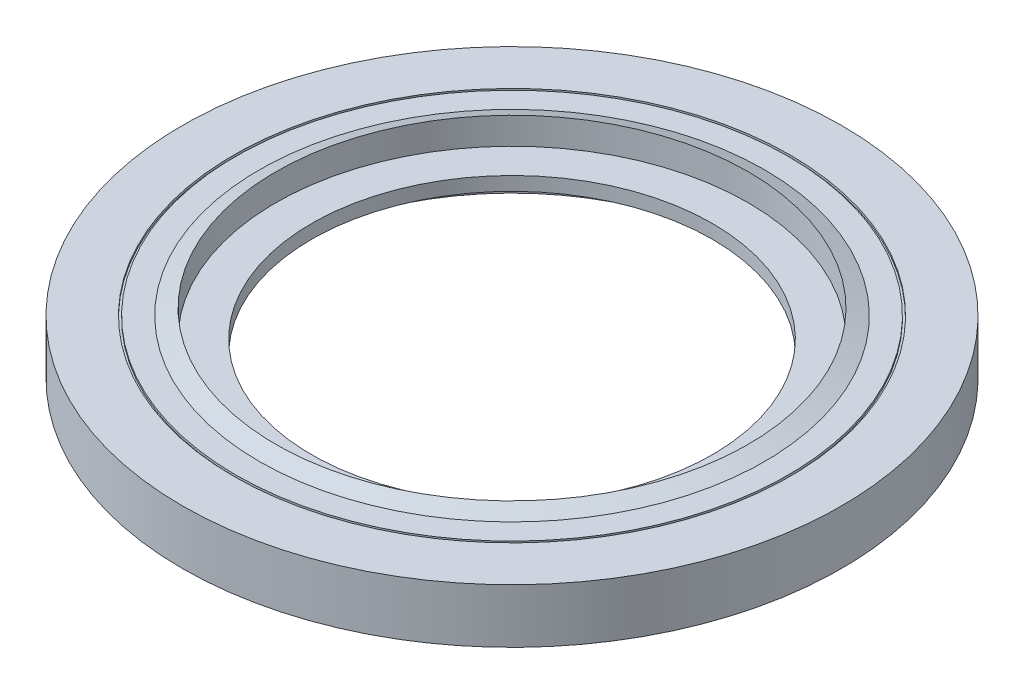
ISO-10303-21;
HEADER;
FILE_DESCRIPTION(('STEP AP214'),'2;1');
FILE_NAME('part.step','',(''),(''),'','','');
FILE_SCHEMA(('AUTOMOTIVE_DESIGN { 1 0 10303 214 1 1 1 1 }'));
ENDSEC;
DATA;
#1=APPLICATION_CONTEXT('core data for automotive mechanical design processes');
#2=APPLICATION_PROTOCOL_DEFINITION('international standard','automotive_design',2000,#1);
#3=PRODUCT_CONTEXT('',#1,'mechanical');
#4=PRODUCT('Part','Part','',(#3));
#5=PRODUCT_RELATED_PRODUCT_CATEGORY('part','',(#4));
#6=PRODUCT_DEFINITION_FORMATION('','',#4);
#7=PRODUCT_DEFINITION_CONTEXT('part definition',#1,'design');
#8=PRODUCT_DEFINITION('design','',#6,#7);
#9=PRODUCT_DEFINITION_SHAPE('','',#8);
#10=(LENGTH_UNIT() NAMED_UNIT(*) SI_UNIT(.MILLI.,.METRE.));
#11=(NAMED_UNIT(*) PLANE_ANGLE_UNIT() SI_UNIT($,.RADIAN.));
#12=(NAMED_UNIT(*) SI_UNIT($,.STERADIAN.) SOLID_ANGLE_UNIT());
#13=UNCERTAINTY_MEASURE_WITH_UNIT(LENGTH_MEASURE(1.E-05),#10,'distance_accuracy_value','');
#14=(GEOMETRIC_REPRESENTATION_CONTEXT(3) GLOBAL_UNCERTAINTY_ASSIGNED_CONTEXT((#13)) GLOBAL_UNIT_ASSIGNED_CONTEXT((#10,
#11,#12)) REPRESENTATION_CONTEXT('',''));
#15=CARTESIAN_POINT('',(0.,0.,0.));
#16=DIRECTION('',(0.,0.,1.));
#17=DIRECTION('',(1.,0.,0.));
#18=AXIS2_PLACEMENT_3D('',#15,#16,#17);
#19=CARTESIAN_POINT('',(9.12,-0.312500000000001,0.));
#20=DIRECTION('',(0.,-1.,0.));
#21=DIRECTION('',(0.,0.,-1.));
#22=AXIS2_PLACEMENT_3D('',#19,#20,#21);
#23=PLANE('',#22);
#24=CARTESIAN_POINT('',(0.,-0.312500000000001,0.));
#25=DIRECTION('',(0.,-1.,0.));
#26=DIRECTION('',(0.,0.,-1.));
#27=AXIS2_PLACEMENT_3D('',#24,#25,#26);
#28=CIRCLE('',#27,10.75);
#29=CARTESIAN_POINT('',(0.,-0.312500000000001,-10.75));
#30=VERTEX_POINT('',#29);
#31=EDGE_CURVE('E10',#30,#30,#28,.T.);
#32=ORIENTED_EDGE('',*,*,#31,.T.);
#33=EDGE_LOOP('',(#32));
#34=FACE_BOUND('',#33,.T.);
#35=CARTESIAN_POINT('',(0.,-0.312500000000001,0.));
#36=DIRECTION('',(0.,-1.,0.));
#37=DIRECTION('',(0.,0.,-1.));
#38=AXIS2_PLACEMENT_3D('',#35,#36,#37);
#39=CIRCLE('',#38,9.12);
#40=CARTESIAN_POINT('',(0.,-0.312500000000001,-9.12));
#41=VERTEX_POINT('',#40);
#42=EDGE_CURVE('E103',#41,#41,#39,.T.);
#43=ORIENTED_EDGE('',*,*,#42,.F.);
#44=EDGE_LOOP('',(#43));
#45=FACE_BOUND('',#44,.T.);
#46=ADVANCED_FACE('F45',(#34,#45),#23,.T.);
#47=CARTESIAN_POINT('',(0.,0.,0.));
#48=DIRECTION('',(0.,-1.,0.));
#49=DIRECTION('',(0.,0.,-1.));
#50=AXIS2_PLACEMENT_3D('',#47,#48,#49);
#51=CYLINDRICAL_SURFACE('',#50,10.75);
#52=CARTESIAN_POINT('',(0.,-1.535,0.));
#53=DIRECTION('',(0.,-1.,0.));
#54=DIRECTION('',(0.,0.,-1.));
#55=AXIS2_PLACEMENT_3D('',#52,#53,#54);
#56=CIRCLE('',#55,10.75);
#57=CARTESIAN_POINT('',(0.,-1.535,-10.75));
#58=VERTEX_POINT('',#57);
#59=EDGE_CURVE('E51',#58,#58,#56,.T.);
#60=ORIENTED_EDGE('',*,*,#59,.T.);
#61=EDGE_LOOP('',(#60));
#62=FACE_BOUND('',#61,.T.);
#63=ORIENTED_EDGE('',*,*,#31,.F.);
#64=EDGE_LOOP('',(#63));
#65=FACE_BOUND('',#64,.T.);
#66=ADVANCED_FACE('F111',(#62,#65),#51,.F.);
#67=CARTESIAN_POINT('',(0.,-1.535,0.));
#68=DIRECTION('',(0.,1.,0.));
#69=DIRECTION('',(0.,0.,1.));
#70=AXIS2_PLACEMENT_3D('',#67,#68,#69);
#71=CONICAL_SURFACE('',#70,10.75,1.19028994968253);
#72=CARTESIAN_POINT('',(0.,-1.235,0.));
#73=DIRECTION('',(0.,-1.,0.));
#74=DIRECTION('',(0.,0.,-1.));
#75=AXIS2_PLACEMENT_3D('',#72,#73,#74);
#76=CIRCLE('',#75,11.5);
#77=CARTESIAN_POINT('',(0.,-1.235,-11.5));
#78=VERTEX_POINT('',#77);
#79=EDGE_CURVE('E55',#78,#78,#76,.T.);
#80=ORIENTED_EDGE('',*,*,#79,.T.);
#81=EDGE_LOOP('',(#80));
#82=FACE_BOUND('',#81,.T.);
#83=ORIENTED_EDGE('',*,*,#59,.F.);
#84=EDGE_LOOP('',(#83));
#85=FACE_BOUND('',#84,.T.);
#86=ADVANCED_FACE('F115',(#82,#85),#71,.T.);
#87=CARTESIAN_POINT('',(11.5,-1.235,0.));
#88=DIRECTION('',(0.,-1.,0.));
#89=DIRECTION('',(0.,0.,-1.));
#90=AXIS2_PLACEMENT_3D('',#87,#88,#89);
#91=PLANE('',#90);
#92=CARTESIAN_POINT('',(0.,-1.235,0.));
#93=DIRECTION('',(0.,-1.,0.));
#94=DIRECTION('',(0.,0.,-1.));
#95=AXIS2_PLACEMENT_3D('',#92,#93,#94);
#96=CIRCLE('',#95,12.5666666666667);
#97=CARTESIAN_POINT('',(0.,-1.235,-12.5666666666667));
#98=VERTEX_POINT('',#97);
#99=EDGE_CURVE('E59',#98,#98,#96,.T.);
#100=ORIENTED_EDGE('',*,*,#99,.T.);
#101=EDGE_LOOP('',(#100));
#102=FACE_BOUND('',#101,.T.);
#103=ORIENTED_EDGE('',*,*,#79,.F.);
#104=EDGE_LOOP('',(#103));
#105=FACE_BOUND('',#104,.T.);
#106=ADVANCED_FACE('F119',(#102,#105),#91,.T.);
#107=CARTESIAN_POINT('',(0.,0.,0.));
#108=DIRECTION('',(0.,-1.,0.));
#109=DIRECTION('',(0.,0.,-1.));
#110=AXIS2_PLACEMENT_3D('',#107,#108,#109);
#111=CYLINDRICAL_SURFACE('',#110,12.5666666666667);
#112=CARTESIAN_POINT('',(0.,-1.135,0.));
#113=DIRECTION('',(0.,-1.,0.));
#114=DIRECTION('',(0.,0.,-1.));
#115=AXIS2_PLACEMENT_3D('',#112,#113,#114);
#116=CIRCLE('',#115,12.5666666666667);
#117=CARTESIAN_POINT('',(0.,-1.135,-12.5666666666667));
#118=VERTEX_POINT('',#117);
#119=EDGE_CURVE('E64',#118,#118,#116,.T.);
#120=ORIENTED_EDGE('',*,*,#119,.T.);
#121=EDGE_LOOP('',(#120));
#122=FACE_BOUND('',#121,.T.);
#123=ORIENTED_EDGE('',*,*,#99,.F.);
#124=EDGE_LOOP('',(#123));
#125=FACE_BOUND('',#124,.T.);
#126=ADVANCED_FACE('F126',(#122,#125),#111,.T.);
#127=CARTESIAN_POINT('',(12.6666666666667,-1.135,0.));
#128=DIRECTION('',(0.,-1.,0.));
#129=DIRECTION('',(0.,0.,-1.));
#130=AXIS2_PLACEMENT_3D('',#127,#128,#129);
#131=PLANE('',#130);
#132=CARTESIAN_POINT('',(0.,-1.135,0.));
#133=DIRECTION('',(0.,-1.,0.));
#134=DIRECTION('',(0.,0.,-1.));
#135=AXIS2_PLACEMENT_3D('',#132,#133,#134);
#136=CIRCLE('',#135,12.6666666666667);
#137=CARTESIAN_POINT('',(0.,-1.135,-12.6666666666667));
#138=VERTEX_POINT('',#137);
#139=EDGE_CURVE('E67',#138,#138,#136,.T.);
#140=ORIENTED_EDGE('',*,*,#139,.T.);
#141=EDGE_LOOP('',(#140));
#142=FACE_BOUND('',#141,.T.);
#143=ORIENTED_EDGE('',*,*,#119,.F.);
#144=EDGE_LOOP('',(#143));
#145=FACE_BOUND('',#144,.T.);
#146=ADVANCED_FACE('F130',(#142,#145),#131,.T.);
#147=CARTESIAN_POINT('',(0.,0.,0.));
#148=DIRECTION('',(0.,-1.,0.));
#149=DIRECTION('',(0.,0.,-1.));
#150=AXIS2_PLACEMENT_3D('',#147,#148,#149);
#151=CYLINDRICAL_SURFACE('',#150,12.6666666666667);
#152=CARTESIAN_POINT('',(0.,-1.235,0.));
#153=DIRECTION('',(0.,-1.,0.));
#154=DIRECTION('',(0.,0.,-1.));
#155=AXIS2_PLACEMENT_3D('',#152,#153,#154);
#156=CIRCLE('',#155,12.6666666666667);
#157=CARTESIAN_POINT('',(0.,-1.235,-12.6666666666667));
#158=VERTEX_POINT('',#157);
#159=EDGE_CURVE('E70',#158,#158,#156,.T.);
#160=ORIENTED_EDGE('',*,*,#159,.T.);
#161=EDGE_LOOP('',(#160));
#162=FACE_BOUND('',#161,.T.);
#163=ORIENTED_EDGE('',*,*,#139,.F.);
#164=EDGE_LOOP('',(#163));
#165=FACE_BOUND('',#164,.T.);
#166=ADVANCED_FACE('F134',(#162,#165),#151,.F.);
#167=CARTESIAN_POINT('',(12.6666666666667,-1.235,0.));
#168=DIRECTION('',(0.,-1.,0.));
#169=DIRECTION('',(0.,0.,-1.));
#170=AXIS2_PLACEMENT_3D('',#167,#168,#169);
#171=PLANE('',#170);
#172=CARTESIAN_POINT('',(0.,-1.235,0.));
#173=DIRECTION('',(0.,-1.,0.));
#174=DIRECTION('',(0.,0.,-1.));
#175=AXIS2_PLACEMENT_3D('',#172,#173,#174);
#176=CIRCLE('',#175,15.);
#177=CARTESIAN_POINT('',(0.,-1.235,-15.));
#178=VERTEX_POINT('',#177);
#179=EDGE_CURVE('E73',#178,#178,#176,.T.);
#180=ORIENTED_EDGE('',*,*,#179,.T.);
#181=EDGE_LOOP('',(#180));
#182=FACE_BOUND('',#181,.T.);
#183=ORIENTED_EDGE('',*,*,#159,.F.);
#184=EDGE_LOOP('',(#183));
#185=FACE_BOUND('',#184,.T.);
#186=ADVANCED_FACE('F138',(#182,#185),#171,.T.);
#187=CARTESIAN_POINT('',(0.,0.,0.));
#188=DIRECTION('',(0.,-1.,0.));
#189=DIRECTION('',(0.,0.,-1.));
#190=AXIS2_PLACEMENT_3D('',#187,#188,#189);
#191=CYLINDRICAL_SURFACE('',#190,15.);
#192=CARTESIAN_POINT('',(0.,1.235,0.));
#193=DIRECTION('',(0.,-1.,0.));
#194=DIRECTION('',(0.,0.,-1.));
#195=AXIS2_PLACEMENT_3D('',#192,#193,#194);
#196=CIRCLE('',#195,15.);
#197=CARTESIAN_POINT('',(0.,1.235,-15.));
#198=VERTEX_POINT('',#197);
#199=EDGE_CURVE('E76',#198,#198,#196,.T.);
#200=ORIENTED_EDGE('',*,*,#199,.T.);
#201=EDGE_LOOP('',(#200));
#202=FACE_BOUND('',#201,.T.);
#203=ORIENTED_EDGE('',*,*,#179,.F.);
#204=EDGE_LOOP('',(#203));
#205=FACE_BOUND('',#204,.T.);
#206=ADVANCED_FACE('F142',(#202,#205),#191,.T.);
#207=CARTESIAN_POINT('',(15.,1.235,0.));
#208=DIRECTION('',(0.,1.,0.));
#209=DIRECTION('',(0.,0.,1.));
#210=AXIS2_PLACEMENT_3D('',#207,#208,#209);
#211=PLANE('',#210);
#212=CARTESIAN_POINT('',(0.,1.235,0.));
#213=DIRECTION('',(0.,-1.,0.));
#214=DIRECTION('',(0.,0.,-1.));
#215=AXIS2_PLACEMENT_3D('',#212,#213,#214);
#216=CIRCLE('',#215,12.6666666666667);
#217=CARTESIAN_POINT('',(0.,1.235,-12.6666666666667));
#218=VERTEX_POINT('',#217);
#219=EDGE_CURVE('E79',#218,#218,#216,.T.);
#220=ORIENTED_EDGE('',*,*,#219,.T.);
#221=EDGE_LOOP('',(#220));
#222=FACE_BOUND('',#221,.T.);
#223=ORIENTED_EDGE('',*,*,#199,.F.);
#224=EDGE_LOOP('',(#223));
#225=FACE_BOUND('',#224,.T.);
#226=ADVANCED_FACE('F146',(#222,#225),#211,.T.);
#227=CARTESIAN_POINT('',(0.,0.,0.));
#228=DIRECTION('',(0.,-1.,0.));
#229=DIRECTION('',(0.,0.,-1.));
#230=AXIS2_PLACEMENT_3D('',#227,#228,#229);
#231=CYLINDRICAL_SURFACE('',#230,12.6666666666667);
#232=CARTESIAN_POINT('',(0.,1.135,0.));
#233=DIRECTION('',(0.,-1.,0.));
#234=DIRECTION('',(0.,0.,-1.));
#235=AXIS2_PLACEMENT_3D('',#232,#233,#234);
#236=CIRCLE('',#235,12.6666666666667);
#237=CARTESIAN_POINT('',(0.,1.135,-12.6666666666667));
#238=VERTEX_POINT('',#237);
#239=EDGE_CURVE('E82',#238,#238,#236,.T.);
#240=ORIENTED_EDGE('',*,*,#239,.T.);
#241=EDGE_LOOP('',(#240));
#242=FACE_BOUND('',#241,.T.);
#243=ORIENTED_EDGE('',*,*,#219,.F.);
#244=EDGE_LOOP('',(#243));
#245=FACE_BOUND('',#244,.T.);
#246=ADVANCED_FACE('F150',(#242,#245),#231,.F.);
#247=CARTESIAN_POINT('',(12.6666666666667,1.135,0.));
#248=DIRECTION('',(0.,1.,0.));
#249=DIRECTION('',(0.,0.,1.));
#250=AXIS2_PLACEMENT_3D('',#247,#248,#249);
#251=PLANE('',#250);
#252=CARTESIAN_POINT('',(0.,1.135,0.));
#253=DIRECTION('',(0.,-1.,0.));
#254=DIRECTION('',(0.,0.,-1.));
#255=AXIS2_PLACEMENT_3D('',#252,#253,#254);
#256=CIRCLE('',#255,12.5666666666667);
#257=CARTESIAN_POINT('',(0.,1.135,-12.5666666666667));
#258=VERTEX_POINT('',#257);
#259=EDGE_CURVE('E85',#258,#258,#256,.T.);
#260=ORIENTED_EDGE('',*,*,#259,.T.);
#261=EDGE_LOOP('',(#260));
#262=FACE_BOUND('',#261,.T.);
#263=ORIENTED_EDGE('',*,*,#239,.F.);
#264=EDGE_LOOP('',(#263));
#265=FACE_BOUND('',#264,.T.);
#266=ADVANCED_FACE('F154',(#262,#265),#251,.T.);
#267=CARTESIAN_POINT('',(0.,0.,0.));
#268=DIRECTION('',(0.,-1.,0.));
#269=DIRECTION('',(0.,0.,-1.));
#270=AXIS2_PLACEMENT_3D('',#267,#268,#269);
#271=CYLINDRICAL_SURFACE('',#270,12.5666666666667);
#272=CARTESIAN_POINT('',(0.,1.235,0.));
#273=DIRECTION('',(0.,-1.,0.));
#274=DIRECTION('',(0.,0.,-1.));
#275=AXIS2_PLACEMENT_3D('',#272,#273,#274);
#276=CIRCLE('',#275,12.5666666666667);
#277=CARTESIAN_POINT('',(0.,1.235,-12.5666666666667));
#278=VERTEX_POINT('',#277);
#279=EDGE_CURVE('E88',#278,#278,#276,.T.);
#280=ORIENTED_EDGE('',*,*,#279,.T.);
#281=EDGE_LOOP('',(#280));
#282=FACE_BOUND('',#281,.T.);
#283=ORIENTED_EDGE('',*,*,#259,.F.);
#284=EDGE_LOOP('',(#283));
#285=FACE_BOUND('',#284,.T.);
#286=ADVANCED_FACE('F158',(#282,#285),#271,.T.);
#287=CARTESIAN_POINT('',(11.5,1.235,0.));
#288=DIRECTION('',(0.,1.,0.));
#289=DIRECTION('',(0.,0.,1.));
#290=AXIS2_PLACEMENT_3D('',#287,#288,#289);
#291=PLANE('',#290);
#292=CARTESIAN_POINT('',(0.,1.235,0.));
#293=DIRECTION('',(0.,-1.,0.));
#294=DIRECTION('',(0.,0.,-1.));
#295=AXIS2_PLACEMENT_3D('',#292,#293,#294);
#296=CIRCLE('',#295,11.5);
#297=CARTESIAN_POINT('',(0.,1.235,-11.5));
#298=VERTEX_POINT('',#297);
#299=EDGE_CURVE('E91',#298,#298,#296,.T.);
#300=ORIENTED_EDGE('',*,*,#299,.T.);
#301=EDGE_LOOP('',(#300));
#302=FACE_BOUND('',#301,.T.);
#303=ORIENTED_EDGE('',*,*,#279,.F.);
#304=EDGE_LOOP('',(#303));
#305=FACE_BOUND('',#304,.T.);
#306=ADVANCED_FACE('F162',(#302,#305),#291,.T.);
#307=CARTESIAN_POINT('',(0.,1.235,0.));
#308=DIRECTION('',(0.,-1.,0.));
#309=DIRECTION('',(0.,0.,-1.));
#310=AXIS2_PLACEMENT_3D('',#307,#308,#309);
#311=CONICAL_SURFACE('',#310,11.5,1.19028994968253);
#312=CARTESIAN_POINT('',(0.,1.535,0.));
#313=DIRECTION('',(0.,-1.,0.));
#314=DIRECTION('',(0.,0.,-1.));
#315=AXIS2_PLACEMENT_3D('',#312,#313,#314);
#316=CIRCLE('',#315,10.75);
#317=CARTESIAN_POINT('',(0.,1.535,-10.75));
#318=VERTEX_POINT('',#317);
#319=EDGE_CURVE('E94',#318,#318,#316,.T.);
#320=ORIENTED_EDGE('',*,*,#319,.T.);
#321=EDGE_LOOP('',(#320));
#322=FACE_BOUND('',#321,.T.);
#323=ORIENTED_EDGE('',*,*,#299,.F.);
#324=EDGE_LOOP('',(#323));
#325=FACE_BOUND('',#324,.T.);
#326=ADVANCED_FACE('F166',(#322,#325),#311,.T.);
#327=CARTESIAN_POINT('',(0.,0.,0.));
#328=DIRECTION('',(0.,-1.,0.));
#329=DIRECTION('',(0.,0.,-1.));
#330=AXIS2_PLACEMENT_3D('',#327,#328,#329);
#331=CYLINDRICAL_SURFACE('',#330,10.75);
#332=CARTESIAN_POINT('',(0.,0.312499999999999,0.));
#333=DIRECTION('',(0.,-1.,0.));
#334=DIRECTION('',(0.,0.,-1.));
#335=AXIS2_PLACEMENT_3D('',#332,#333,#334);
#336=CIRCLE('',#335,10.75);
#337=CARTESIAN_POINT('',(0.,0.312499999999999,-10.75));
#338=VERTEX_POINT('',#337);
#339=EDGE_CURVE('E97',#338,#338,#336,.T.);
#340=ORIENTED_EDGE('',*,*,#339,.T.);
#341=EDGE_LOOP('',(#340));
#342=FACE_BOUND('',#341,.T.);
#343=ORIENTED_EDGE('',*,*,#319,.F.);
#344=EDGE_LOOP('',(#343));
#345=FACE_BOUND('',#344,.T.);
#346=ADVANCED_FACE('F170',(#342,#345),#331,.F.);
#347=CARTESIAN_POINT('',(9.12,0.312499999999999,0.));
#348=DIRECTION('',(0.,1.,0.));
#349=DIRECTION('',(0.,0.,1.));
#350=AXIS2_PLACEMENT_3D('',#347,#348,#349);
#351=PLANE('',#350);
#352=CARTESIAN_POINT('',(0.,0.312499999999999,0.));
#353=DIRECTION('',(0.,-1.,0.));
#354=DIRECTION('',(0.,0.,-1.));
#355=AXIS2_PLACEMENT_3D('',#352,#353,#354);
#356=CIRCLE('',#355,9.12);
#357=CARTESIAN_POINT('',(0.,0.312499999999999,-9.12));
#358=VERTEX_POINT('',#357);
#359=EDGE_CURVE('E100',#358,#358,#356,.T.);
#360=ORIENTED_EDGE('',*,*,#359,.T.);
#361=EDGE_LOOP('',(#360));
#362=FACE_BOUND('',#361,.T.);
#363=ORIENTED_EDGE('',*,*,#339,.F.);
#364=EDGE_LOOP('',(#363));
#365=FACE_BOUND('',#364,.T.);
#366=ADVANCED_FACE('F174',(#362,#365),#351,.T.);
#367=CARTESIAN_POINT('',(0.,0.,0.));
#368=DIRECTION('',(0.,-1.,0.));
#369=DIRECTION('',(0.,0.,-1.));
#370=AXIS2_PLACEMENT_3D('',#367,#368,#369);
#371=CYLINDRICAL_SURFACE('',#370,9.12);
#372=ORIENTED_EDGE('',*,*,#42,.T.);
#373=EDGE_LOOP('',(#372));
#374=FACE_BOUND('',#373,.T.);
#375=ORIENTED_EDGE('',*,*,#359,.F.);
#376=EDGE_LOOP('',(#375));
#377=FACE_BOUND('',#376,.T.);
#378=ADVANCED_FACE('F107',(#374,#377),#371,.F.);
#379=CLOSED_SHELL('',(#46,#66,#86,#106,#126,#146,#166,#186,#206,#226,#246,#266,#286,#306,#326,
#346,#366,#378));
#380=MANIFOLD_SOLID_BREP('B2',#379);
#381=ADVANCED_BREP_SHAPE_REPRESENTATION('',(#18,#380),#14);
#382=SHAPE_DEFINITION_REPRESENTATION(#9,#381);
ENDSEC;
END-ISO-10303-21;
